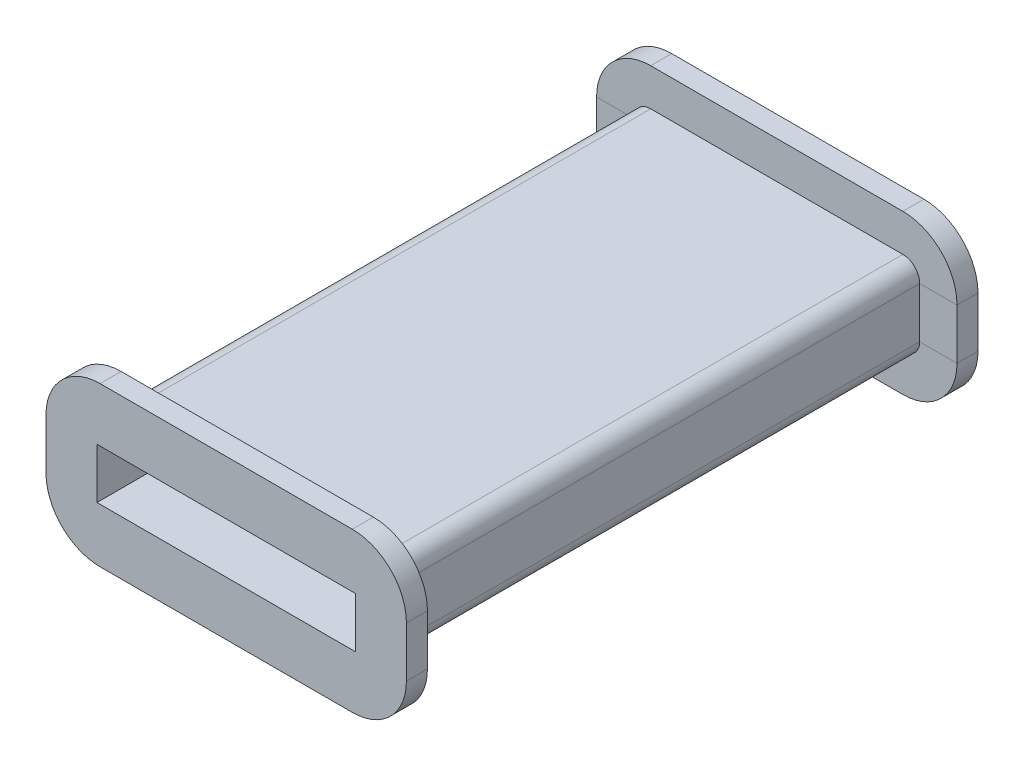
ISO-10303-21;
HEADER;
FILE_DESCRIPTION(('STEP AP214'),'2;1');
FILE_NAME('part.step','',(''),(''),'','','');
FILE_SCHEMA(('AUTOMOTIVE_DESIGN { 1 0 10303 214 1 1 1 1 }'));
ENDSEC;
DATA;
#1=APPLICATION_CONTEXT('core data for automotive mechanical design processes');
#2=APPLICATION_PROTOCOL_DEFINITION('international standard','automotive_design',2000,#1);
#3=PRODUCT_CONTEXT('',#1,'mechanical');
#4=PRODUCT('Part','Part','',(#3));
#5=PRODUCT_RELATED_PRODUCT_CATEGORY('part','',(#4));
#6=PRODUCT_DEFINITION_FORMATION('','',#4);
#7=PRODUCT_DEFINITION_CONTEXT('part definition',#1,'design');
#8=PRODUCT_DEFINITION('design','',#6,#7);
#9=PRODUCT_DEFINITION_SHAPE('','',#8);
#10=(LENGTH_UNIT() NAMED_UNIT(*) SI_UNIT(.MILLI.,.METRE.));
#11=(NAMED_UNIT(*) PLANE_ANGLE_UNIT() SI_UNIT($,.RADIAN.));
#12=(NAMED_UNIT(*) SI_UNIT($,.STERADIAN.) SOLID_ANGLE_UNIT());
#13=UNCERTAINTY_MEASURE_WITH_UNIT(LENGTH_MEASURE(1.E-05),#10,'distance_accuracy_value','');
#14=(GEOMETRIC_REPRESENTATION_CONTEXT(3) GLOBAL_UNCERTAINTY_ASSIGNED_CONTEXT((#13)) GLOBAL_UNIT_ASSIGNED_CONTEXT((#10,
#11,#12)) REPRESENTATION_CONTEXT('',''));
#15=CARTESIAN_POINT('',(0.,0.,0.));
#16=DIRECTION('',(0.,0.,1.));
#17=DIRECTION('',(1.,0.,0.));
#18=AXIS2_PLACEMENT_3D('',#15,#16,#17);
#19=CARTESIAN_POINT('',(-13.6,-2.4,27.2));
#20=DIRECTION('',(1.,0.,0.));
#21=DIRECTION('',(0.,0.,-1.));
#22=AXIS2_PLACEMENT_3D('',#19,#20,#21);
#23=PLANE('',#22);
#24=DIRECTION('',(0.,1.,0.));
#25=VECTOR('',#24,1.);
#26=CARTESIAN_POINT('',(-13.6,-2.4,-25.2));
#27=LINE('',#26,#25);
#28=CARTESIAN_POINT('',(-13.6,-2.4,-25.2));
#29=VERTEX_POINT('',#28);
#30=CARTESIAN_POINT('',(-13.6,2.4,-25.2));
#31=VERTEX_POINT('',#30);
#32=EDGE_CURVE('E55',#29,#31,#27,.T.);
#33=ORIENTED_EDGE('',*,*,#32,.F.);
#34=DIRECTION('',(0.,0.,-1.));
#35=VECTOR('',#34,1.);
#36=CARTESIAN_POINT('',(-13.6,-2.4,27.2));
#37=LINE('',#36,#35);
#38=CARTESIAN_POINT('',(-13.6,-2.4,25.2));
#39=VERTEX_POINT('',#38);
#40=EDGE_CURVE('E517',#39,#29,#37,.T.);
#41=ORIENTED_EDGE('',*,*,#40,.F.);
#42=DIRECTION('',(0.,-1.,0.));
#43=VECTOR('',#42,1.);
#44=CARTESIAN_POINT('',(-13.6,2.4,25.2));
#45=LINE('',#44,#43);
#46=CARTESIAN_POINT('',(-13.6,2.4,25.2));
#47=VERTEX_POINT('',#46);
#48=EDGE_CURVE('E319',#47,#39,#45,.T.);
#49=ORIENTED_EDGE('',*,*,#48,.F.);
#50=DIRECTION('',(0.,0.,-1.));
#51=VECTOR('',#50,1.);
#52=CARTESIAN_POINT('',(-13.6,2.4,27.2));
#53=LINE('',#52,#51);
#54=EDGE_CURVE('E519',#47,#31,#53,.T.);
#55=ORIENTED_EDGE('',*,*,#54,.T.);
#56=EDGE_LOOP('',(#33,#41,#49,#55));
#57=FACE_BOUND('',#56,.T.);
#58=ADVANCED_FACE('F40',(#57),#23,.F.);
#59=CARTESIAN_POINT('',(-12.,-2.4,27.2));
#60=DIRECTION('',(0.,0.,-1.));
#61=DIRECTION('',(-1.,0.,0.));
#62=AXIS2_PLACEMENT_3D('',#59,#60,#61);
#63=CYLINDRICAL_SURFACE('',#62,1.6);
#64=CARTESIAN_POINT('',(-12.,-2.4,-25.2));
#65=DIRECTION('',(0.,0.,-1.));
#66=DIRECTION('',(0.,-1.,0.));
#67=AXIS2_PLACEMENT_3D('',#64,#65,#66);
#68=CIRCLE('',#67,1.6);
#69=CARTESIAN_POINT('',(-12.,-4.,-25.2));
#70=VERTEX_POINT('',#69);
#71=EDGE_CURVE('E271',#70,#29,#68,.T.);
#72=ORIENTED_EDGE('',*,*,#71,.F.);
#73=DIRECTION('',(0.,0.,-1.));
#74=VECTOR('',#73,1.);
#75=CARTESIAN_POINT('',(-12.,-4.,27.2));
#76=LINE('',#75,#74);
#77=CARTESIAN_POINT('',(-12.,-4.,25.2));
#78=VERTEX_POINT('',#77);
#79=EDGE_CURVE('E11',#78,#70,#76,.T.);
#80=ORIENTED_EDGE('',*,*,#79,.F.);
#81=CARTESIAN_POINT('',(-12.,-2.4,25.2));
#82=DIRECTION('',(0.,0.,1.));
#83=DIRECTION('',(-1.,0.,0.));
#84=AXIS2_PLACEMENT_3D('',#81,#82,#83);
#85=CIRCLE('',#84,1.6);
#86=EDGE_CURVE('E327',#39,#78,#85,.T.);
#87=ORIENTED_EDGE('',*,*,#86,.F.);
#88=ORIENTED_EDGE('',*,*,#40,.T.);
#89=EDGE_LOOP('',(#72,#80,#87,#88));
#90=FACE_BOUND('',#89,.T.);
#91=ADVANCED_FACE('F42',(#90),#63,.T.);
#92=CARTESIAN_POINT('',(-12.,2.4,27.2));
#93=DIRECTION('',(0.,0.,-1.));
#94=DIRECTION('',(-1.,0.,0.));
#95=AXIS2_PLACEMENT_3D('',#92,#93,#94);
#96=CYLINDRICAL_SURFACE('',#95,1.6);
#97=CARTESIAN_POINT('',(-12.,2.4,-25.2));
#98=DIRECTION('',(0.,0.,-1.));
#99=DIRECTION('',(-1.,0.,0.));
#100=AXIS2_PLACEMENT_3D('',#97,#98,#99);
#101=CIRCLE('',#100,1.6);
#102=CARTESIAN_POINT('',(-12.,4.,-25.2));
#103=VERTEX_POINT('',#102);
#104=EDGE_CURVE('E63',#31,#103,#101,.T.);
#105=ORIENTED_EDGE('',*,*,#104,.F.);
#106=ORIENTED_EDGE('',*,*,#54,.F.);
#107=CARTESIAN_POINT('',(-12.,2.4,25.2));
#108=DIRECTION('',(0.,0.,1.));
#109=DIRECTION('',(0.,1.,0.));
#110=AXIS2_PLACEMENT_3D('',#107,#108,#109);
#111=CIRCLE('',#110,1.6);
#112=CARTESIAN_POINT('',(-12.,4.,25.2));
#113=VERTEX_POINT('',#112);
#114=EDGE_CURVE('E310',#113,#47,#111,.T.);
#115=ORIENTED_EDGE('',*,*,#114,.F.);
#116=DIRECTION('',(0.,0.,-1.));
#117=VECTOR('',#116,1.);
#118=CARTESIAN_POINT('',(-12.,4.,27.2));
#119=LINE('',#118,#117);
#120=EDGE_CURVE('E521',#113,#103,#119,.T.);
#121=ORIENTED_EDGE('',*,*,#120,.T.);
#122=EDGE_LOOP('',(#105,#106,#115,#121));
#123=FACE_BOUND('',#122,.T.);
#124=ADVANCED_FACE('F559',(#123),#96,.T.);
#125=CARTESIAN_POINT('',(13.6,2.4,27.2));
#126=DIRECTION('',(-1.,0.,0.));
#127=DIRECTION('',(0.,0.,1.));
#128=AXIS2_PLACEMENT_3D('',#125,#126,#127);
#129=PLANE('',#128);
#130=DIRECTION('',(0.,1.,0.));
#131=VECTOR('',#130,1.);
#132=CARTESIAN_POINT('',(13.6,-2.4,25.2));
#133=LINE('',#132,#131);
#134=CARTESIAN_POINT('',(13.6,-2.4,25.2));
#135=VERTEX_POINT('',#134);
#136=CARTESIAN_POINT('',(13.6,2.4,25.2));
#137=VERTEX_POINT('',#136);
#138=EDGE_CURVE('E359',#135,#137,#133,.T.);
#139=ORIENTED_EDGE('',*,*,#138,.F.);
#140=DIRECTION('',(0.,0.,-1.));
#141=VECTOR('',#140,1.);
#142=CARTESIAN_POINT('',(13.6,-2.4,27.2));
#143=LINE('',#142,#141);
#144=CARTESIAN_POINT('',(13.6,-2.4,-25.2));
#145=VERTEX_POINT('',#144);
#146=EDGE_CURVE('E528',#135,#145,#143,.T.);
#147=ORIENTED_EDGE('',*,*,#146,.T.);
#148=DIRECTION('',(0.,-1.,0.));
#149=VECTOR('',#148,1.);
#150=CARTESIAN_POINT('',(13.6,2.4,-25.2));
#151=LINE('',#150,#149);
#152=CARTESIAN_POINT('',(13.6,2.4,-25.2));
#153=VERTEX_POINT('',#152);
#154=EDGE_CURVE('E398',#153,#145,#151,.T.);
#155=ORIENTED_EDGE('',*,*,#154,.F.);
#156=DIRECTION('',(0.,0.,-1.));
#157=VECTOR('',#156,1.);
#158=CARTESIAN_POINT('',(13.6,2.4,27.2));
#159=LINE('',#158,#157);
#160=EDGE_CURVE('E526',#137,#153,#159,.T.);
#161=ORIENTED_EDGE('',*,*,#160,.F.);
#162=EDGE_LOOP('',(#139,#147,#155,#161));
#163=FACE_BOUND('',#162,.T.);
#164=ADVANCED_FACE('F546',(#163),#129,.F.);
#165=CARTESIAN_POINT('',(12.,-2.4,27.2));
#166=DIRECTION('',(0.,0.,-1.));
#167=DIRECTION('',(-1.,0.,0.));
#168=AXIS2_PLACEMENT_3D('',#165,#166,#167);
#169=CYLINDRICAL_SURFACE('',#168,1.6);
#170=CARTESIAN_POINT('',(12.,-2.4,25.2));
#171=DIRECTION('',(0.,0.,1.));
#172=DIRECTION('',(0.,-1.,0.));
#173=AXIS2_PLACEMENT_3D('',#170,#171,#172);
#174=CIRCLE('',#173,1.6);
#175=CARTESIAN_POINT('',(12.,-4.,25.2));
#176=VERTEX_POINT('',#175);
#177=EDGE_CURVE('E354',#176,#135,#174,.T.);
#178=ORIENTED_EDGE('',*,*,#177,.F.);
#179=DIRECTION('',(0.,0.,-1.));
#180=VECTOR('',#179,1.);
#181=CARTESIAN_POINT('',(12.,-4.,27.2));
#182=LINE('',#181,#180);
#183=CARTESIAN_POINT('',(12.,-4.,-25.2));
#184=VERTEX_POINT('',#183);
#185=EDGE_CURVE('E48',#176,#184,#182,.T.);
#186=ORIENTED_EDGE('',*,*,#185,.T.);
#187=CARTESIAN_POINT('',(12.,-2.4,-25.2));
#188=DIRECTION('',(0.,0.,-1.));
#189=DIRECTION('',(1.,0.,0.));
#190=AXIS2_PLACEMENT_3D('',#187,#188,#189);
#191=CIRCLE('',#190,1.6);
#192=EDGE_CURVE('E403',#145,#184,#191,.T.);
#193=ORIENTED_EDGE('',*,*,#192,.F.);
#194=ORIENTED_EDGE('',*,*,#146,.F.);
#195=EDGE_LOOP('',(#178,#186,#193,#194));
#196=FACE_BOUND('',#195,.T.);
#197=ADVANCED_FACE('F533',(#196),#169,.T.);
#198=CARTESIAN_POINT('',(12.,2.4,27.2));
#199=DIRECTION('',(0.,0.,-1.));
#200=DIRECTION('',(-1.,0.,0.));
#201=AXIS2_PLACEMENT_3D('',#198,#199,#200);
#202=CYLINDRICAL_SURFACE('',#201,1.6);
#203=CARTESIAN_POINT('',(12.,2.4,25.2));
#204=DIRECTION('',(0.,0.,1.));
#205=DIRECTION('',(1.,0.,0.));
#206=AXIS2_PLACEMENT_3D('',#203,#204,#205);
#207=CIRCLE('',#206,1.6);
#208=CARTESIAN_POINT('',(12.,4.,25.2));
#209=VERTEX_POINT('',#208);
#210=EDGE_CURVE('E367',#137,#209,#207,.T.);
#211=ORIENTED_EDGE('',*,*,#210,.F.);
#212=ORIENTED_EDGE('',*,*,#160,.T.);
#213=CARTESIAN_POINT('',(12.,2.4,-25.2));
#214=DIRECTION('',(0.,0.,-1.));
#215=DIRECTION('',(0.,1.,0.));
#216=AXIS2_PLACEMENT_3D('',#213,#214,#215);
#217=CIRCLE('',#216,1.6);
#218=CARTESIAN_POINT('',(12.,4.,-25.2));
#219=VERTEX_POINT('',#218);
#220=EDGE_CURVE('E390',#219,#153,#217,.T.);
#221=ORIENTED_EDGE('',*,*,#220,.F.);
#222=DIRECTION('',(0.,0.,-1.));
#223=VECTOR('',#222,1.);
#224=CARTESIAN_POINT('',(12.,4.,27.2));
#225=LINE('',#224,#223);
#226=EDGE_CURVE('E523',#209,#219,#225,.T.);
#227=ORIENTED_EDGE('',*,*,#226,.F.);
#228=EDGE_LOOP('',(#211,#212,#221,#227));
#229=FACE_BOUND('',#228,.T.);
#230=ADVANCED_FACE('F598',(#229),#202,.T.);
#231=CARTESIAN_POINT('',(-12.,4.,27.2));
#232=DIRECTION('',(0.,-1.,0.));
#233=DIRECTION('',(0.,0.,-1.));
#234=AXIS2_PLACEMENT_3D('',#231,#232,#233);
#235=PLANE('',#234);
#236=DIRECTION('',(-1.,0.,0.));
#237=VECTOR('',#236,1.);
#238=CARTESIAN_POINT('',(12.,4.,25.2));
#239=LINE('',#238,#237);
#240=EDGE_CURVE('E461',#209,#113,#239,.T.);
#241=ORIENTED_EDGE('',*,*,#240,.F.);
#242=ORIENTED_EDGE('',*,*,#226,.T.);
#243=DIRECTION('',(-1.,0.,0.));
#244=VECTOR('',#243,1.);
#245=CARTESIAN_POINT('',(12.,4.,-25.2));
#246=LINE('',#245,#244);
#247=EDGE_CURVE('E478',#219,#103,#246,.T.);
#248=ORIENTED_EDGE('',*,*,#247,.T.);
#249=ORIENTED_EDGE('',*,*,#120,.F.);
#250=EDGE_LOOP('',(#241,#242,#248,#249));
#251=FACE_BOUND('',#250,.T.);
#252=ADVANCED_FACE('F601',(#251),#235,.F.);
#253=CARTESIAN_POINT('',(-12.,-2.4,27.2));
#254=DIRECTION('',(0.,0.,1.));
#255=DIRECTION('',(1.,0.,0.));
#256=AXIS2_PLACEMENT_3D('',#253,#254,#255);
#257=PLANE('',#256);
#258=CARTESIAN_POINT('',(-12.,-2.4,27.2));
#259=DIRECTION('',(0.,0.,1.));
#260=DIRECTION('',(-1.,0.,0.));
#261=AXIS2_PLACEMENT_3D('',#258,#259,#260);
#262=CIRCLE('',#261,5.14999999999999);
#263=CARTESIAN_POINT('',(-17.15,-2.4,27.2));
#264=VERTEX_POINT('',#263);
#265=CARTESIAN_POINT('',(-12.,-7.54999999999999,27.2));
#266=VERTEX_POINT('',#265);
#267=EDGE_CURVE('E330',#264,#266,#262,.T.);
#268=ORIENTED_EDGE('',*,*,#267,.T.);
#269=DIRECTION('',(-1.,0.,0.));
#270=VECTOR('',#269,1.);
#271=CARTESIAN_POINT('',(12.,-7.54999999999999,27.2));
#272=LINE('',#271,#270);
#273=CARTESIAN_POINT('',(12.,-7.54999999999999,27.2));
#274=VERTEX_POINT('',#273);
#275=EDGE_CURVE('E449',#274,#266,#272,.T.);
#276=ORIENTED_EDGE('',*,*,#275,.F.);
#277=CARTESIAN_POINT('',(12.,-2.4,27.2));
#278=DIRECTION('',(0.,0.,1.));
#279=DIRECTION('',(0.,-1.,0.));
#280=AXIS2_PLACEMENT_3D('',#277,#278,#279);
#281=CIRCLE('',#280,5.14999999999999);
#282=CARTESIAN_POINT('',(17.15,-2.4,27.2));
#283=VERTEX_POINT('',#282);
#284=EDGE_CURVE('E347',#274,#283,#281,.T.);
#285=ORIENTED_EDGE('',*,*,#284,.T.);
#286=DIRECTION('',(0.,1.,0.));
#287=VECTOR('',#286,1.);
#288=CARTESIAN_POINT('',(17.15,-2.4,27.2));
#289=LINE('',#288,#287);
#290=CARTESIAN_POINT('',(17.15,2.40000000000001,27.2));
#291=VERTEX_POINT('',#290);
#292=EDGE_CURVE('E360',#283,#291,#289,.T.);
#293=ORIENTED_EDGE('',*,*,#292,.T.);
#294=CARTESIAN_POINT('',(12.,2.4,27.2));
#295=DIRECTION('',(0.,0.,1.));
#296=DIRECTION('',(1.,0.,0.));
#297=AXIS2_PLACEMENT_3D('',#294,#295,#296);
#298=CIRCLE('',#297,5.14999999999999);
#299=CARTESIAN_POINT('',(12.,7.54999999999999,27.2));
#300=VERTEX_POINT('',#299);
#301=EDGE_CURVE('E364',#291,#300,#298,.T.);
#302=ORIENTED_EDGE('',*,*,#301,.T.);
#303=DIRECTION('',(-1.,0.,0.));
#304=VECTOR('',#303,1.);
#305=CARTESIAN_POINT('',(12.,7.54999999999999,27.2));
#306=LINE('',#305,#304);
#307=CARTESIAN_POINT('',(-12.,7.54999999999999,27.2));
#308=VERTEX_POINT('',#307);
#309=EDGE_CURVE('E466',#300,#308,#306,.T.);
#310=ORIENTED_EDGE('',*,*,#309,.T.);
#311=CARTESIAN_POINT('',(-12.,2.4,27.2));
#312=DIRECTION('',(0.,0.,1.));
#313=DIRECTION('',(0.,1.,0.));
#314=AXIS2_PLACEMENT_3D('',#311,#312,#313);
#315=CIRCLE('',#314,5.14999999999999);
#316=CARTESIAN_POINT('',(-17.15,2.40000000000001,27.2));
#317=VERTEX_POINT('',#316);
#318=EDGE_CURVE('E337',#308,#317,#315,.T.);
#319=ORIENTED_EDGE('',*,*,#318,.T.);
#320=DIRECTION('',(0.,-1.,0.));
#321=VECTOR('',#320,1.);
#322=CARTESIAN_POINT('',(-17.15,2.4,27.2));
#323=LINE('',#322,#321);
#324=EDGE_CURVE('E342',#317,#264,#323,.T.);
#325=ORIENTED_EDGE('',*,*,#324,.T.);
#326=EDGE_LOOP('',(#268,#276,#285,#293,#302,#310,#319,#325));
#327=FACE_BOUND('',#326,.T.);
#328=DIRECTION('',(0.,1.,0.));
#329=VECTOR('',#328,1.);
#330=CARTESIAN_POINT('',(12.3,2.4,27.2));
#331=LINE('',#330,#329);
#332=CARTESIAN_POINT('',(12.3,-2.4,27.2));
#333=VERTEX_POINT('',#332);
#334=CARTESIAN_POINT('',(12.3,2.4,27.2));
#335=VERTEX_POINT('',#334);
#336=EDGE_CURVE('E489',#333,#335,#331,.T.);
#337=ORIENTED_EDGE('',*,*,#336,.F.);
#338=DIRECTION('',(1.,0.,0.));
#339=VECTOR('',#338,1.);
#340=CARTESIAN_POINT('',(12.3,-2.4,27.2));
#341=LINE('',#340,#339);
#342=CARTESIAN_POINT('',(-12.3,-2.4,27.2));
#343=VERTEX_POINT('',#342);
#344=EDGE_CURVE('E487',#343,#333,#341,.T.);
#345=ORIENTED_EDGE('',*,*,#344,.F.);
#346=DIRECTION('',(0.,-1.,0.));
#347=VECTOR('',#346,1.);
#348=CARTESIAN_POINT('',(-12.3,-2.4,27.2));
#349=LINE('',#348,#347);
#350=CARTESIAN_POINT('',(-12.3,2.4,27.2));
#351=VERTEX_POINT('',#350);
#352=EDGE_CURVE('E495',#351,#343,#349,.T.);
#353=ORIENTED_EDGE('',*,*,#352,.F.);
#354=DIRECTION('',(-1.,0.,0.));
#355=VECTOR('',#354,1.);
#356=CARTESIAN_POINT('',(-12.3,2.4,27.2));
#357=LINE('',#356,#355);
#358=EDGE_CURVE('E492',#335,#351,#357,.T.);
#359=ORIENTED_EDGE('',*,*,#358,.F.);
#360=EDGE_LOOP('',(#337,#345,#353,#359));
#361=FACE_BOUND('',#360,.T.);
#362=ADVANCED_FACE('F576',(#327,#361),#257,.T.);
#363=CARTESIAN_POINT('',(-12.,-2.4,-27.2));
#364=DIRECTION('',(0.,0.,1.));
#365=DIRECTION('',(1.,0.,0.));
#366=AXIS2_PLACEMENT_3D('',#363,#364,#365);
#367=PLANE('',#366);
#368=CARTESIAN_POINT('',(12.,-2.4,-27.2));
#369=DIRECTION('',(0.,0.,-1.));
#370=DIRECTION('',(1.,0.,0.));
#371=AXIS2_PLACEMENT_3D('',#368,#369,#370);
#372=CIRCLE('',#371,5.15);
#373=CARTESIAN_POINT('',(17.15,-2.4,-27.2));
#374=VERTEX_POINT('',#373);
#375=CARTESIAN_POINT('',(12.,-7.55,-27.2));
#376=VERTEX_POINT('',#375);
#377=EDGE_CURVE('E406',#374,#376,#372,.T.);
#378=ORIENTED_EDGE('',*,*,#377,.T.);
#379=DIRECTION('',(-1.,0.,0.));
#380=VECTOR('',#379,1.);
#381=CARTESIAN_POINT('',(12.,-7.55,-27.2));
#382=LINE('',#381,#380);
#383=CARTESIAN_POINT('',(-12.,-7.55,-27.2));
#384=VERTEX_POINT('',#383);
#385=EDGE_CURVE('E454',#376,#384,#382,.T.);
#386=ORIENTED_EDGE('',*,*,#385,.T.);
#387=CARTESIAN_POINT('',(-12.,-2.4,-27.2));
#388=DIRECTION('',(0.,0.,-1.));
#389=DIRECTION('',(0.,-1.,0.));
#390=AXIS2_PLACEMENT_3D('',#387,#388,#389);
#391=CIRCLE('',#390,5.15);
#392=CARTESIAN_POINT('',(-17.15,-2.4,-27.2));
#393=VERTEX_POINT('',#392);
#394=EDGE_CURVE('E281',#384,#393,#391,.T.);
#395=ORIENTED_EDGE('',*,*,#394,.T.);
#396=DIRECTION('',(0.,1.,0.));
#397=VECTOR('',#396,1.);
#398=CARTESIAN_POINT('',(-17.15,-2.4,-27.2));
#399=LINE('',#398,#397);
#400=CARTESIAN_POINT('',(-17.15,2.4,-27.2));
#401=VERTEX_POINT('',#400);
#402=EDGE_CURVE('E277',#393,#401,#399,.T.);
#403=ORIENTED_EDGE('',*,*,#402,.T.);
#404=CARTESIAN_POINT('',(-12.,2.4,-27.2));
#405=DIRECTION('',(0.,0.,-1.));
#406=DIRECTION('',(-1.,0.,0.));
#407=AXIS2_PLACEMENT_3D('',#404,#405,#406);
#408=CIRCLE('',#407,5.15);
#409=CARTESIAN_POINT('',(-12.,7.55,-27.2));
#410=VERTEX_POINT('',#409);
#411=EDGE_CURVE('E293',#401,#410,#408,.T.);
#412=ORIENTED_EDGE('',*,*,#411,.T.);
#413=DIRECTION('',(-1.,0.,0.));
#414=VECTOR('',#413,1.);
#415=CARTESIAN_POINT('',(12.,7.55,-27.2));
#416=LINE('',#415,#414);
#417=CARTESIAN_POINT('',(12.,7.55,-27.2));
#418=VERTEX_POINT('',#417);
#419=EDGE_CURVE('E484',#418,#410,#416,.T.);
#420=ORIENTED_EDGE('',*,*,#419,.F.);
#421=CARTESIAN_POINT('',(12.,2.4,-27.2));
#422=DIRECTION('',(0.,0.,-1.));
#423=DIRECTION('',(0.,1.,0.));
#424=AXIS2_PLACEMENT_3D('',#421,#422,#423);
#425=CIRCLE('',#424,5.15);
#426=CARTESIAN_POINT('',(17.15,2.40000000000001,-27.2));
#427=VERTEX_POINT('',#426);
#428=EDGE_CURVE('E410',#418,#427,#425,.T.);
#429=ORIENTED_EDGE('',*,*,#428,.T.);
#430=DIRECTION('',(0.,-1.,0.));
#431=VECTOR('',#430,1.);
#432=CARTESIAN_POINT('',(17.15,2.4,-27.2));
#433=LINE('',#432,#431);
#434=EDGE_CURVE('E416',#427,#374,#433,.T.);
#435=ORIENTED_EDGE('',*,*,#434,.T.);
#436=EDGE_LOOP('',(#378,#386,#395,#403,#412,#420,#429,#435));
#437=FACE_BOUND('',#436,.T.);
#438=DIRECTION('',(1.,0.,0.));
#439=VECTOR('',#438,1.);
#440=CARTESIAN_POINT('',(12.3,-2.4,-27.2));
#441=LINE('',#440,#439);
#442=CARTESIAN_POINT('',(-12.3,-2.4,-27.2));
#443=VERTEX_POINT('',#442);
#444=CARTESIAN_POINT('',(12.3,-2.4,-27.2));
#445=VERTEX_POINT('',#444);
#446=EDGE_CURVE('E486',#443,#445,#441,.T.);
#447=ORIENTED_EDGE('',*,*,#446,.T.);
#448=DIRECTION('',(0.,1.,0.));
#449=VECTOR('',#448,1.);
#450=CARTESIAN_POINT('',(12.3,2.4,-27.2));
#451=LINE('',#450,#449);
#452=CARTESIAN_POINT('',(12.3,2.4,-27.2));
#453=VERTEX_POINT('',#452);
#454=EDGE_CURVE('E500',#445,#453,#451,.T.);
#455=ORIENTED_EDGE('',*,*,#454,.T.);
#456=DIRECTION('',(-1.,0.,0.));
#457=VECTOR('',#456,1.);
#458=CARTESIAN_POINT('',(-12.3,2.4,-27.2));
#459=LINE('',#458,#457);
#460=CARTESIAN_POINT('',(-12.3,2.4,-27.2));
#461=VERTEX_POINT('',#460);
#462=EDGE_CURVE('E503',#453,#461,#459,.T.);
#463=ORIENTED_EDGE('',*,*,#462,.T.);
#464=DIRECTION('',(0.,-1.,0.));
#465=VECTOR('',#464,1.);
#466=CARTESIAN_POINT('',(-12.3,-2.4,-27.2));
#467=LINE('',#466,#465);
#468=EDGE_CURVE('E490',#461,#443,#467,.T.);
#469=ORIENTED_EDGE('',*,*,#468,.T.);
#470=EDGE_LOOP('',(#447,#455,#463,#469));
#471=FACE_BOUND('',#470,.T.);
#472=ADVANCED_FACE('F611',(#437,#471),#367,.F.);
#473=CARTESIAN_POINT('',(-12.,-4.,27.2));
#474=DIRECTION('',(0.,1.,0.));
#475=DIRECTION('',(0.,0.,1.));
#476=AXIS2_PLACEMENT_3D('',#473,#474,#475);
#477=PLANE('',#476);
#478=ORIENTED_EDGE('',*,*,#185,.F.);
#479=DIRECTION('',(-1.,0.,0.));
#480=VECTOR('',#479,1.);
#481=CARTESIAN_POINT('',(12.,-4.,25.2));
#482=LINE('',#481,#480);
#483=EDGE_CURVE('E443',#176,#78,#482,.T.);
#484=ORIENTED_EDGE('',*,*,#483,.T.);
#485=ORIENTED_EDGE('',*,*,#79,.T.);
#486=DIRECTION('',(-1.,0.,0.));
#487=VECTOR('',#486,1.);
#488=CARTESIAN_POINT('',(12.,-4.,-25.2));
#489=LINE('',#488,#487);
#490=EDGE_CURVE('E459',#184,#70,#489,.T.);
#491=ORIENTED_EDGE('',*,*,#490,.F.);
#492=EDGE_LOOP('',(#478,#484,#485,#491));
#493=FACE_BOUND('',#492,.T.);
#494=ADVANCED_FACE('F537',(#493),#477,.F.);
#495=CARTESIAN_POINT('',(12.3,-2.4,27.2));
#496=DIRECTION('',(0.,1.,0.));
#497=DIRECTION('',(0.,0.,1.));
#498=AXIS2_PLACEMENT_3D('',#495,#496,#497);
#499=PLANE('',#498);
#500=ORIENTED_EDGE('',*,*,#446,.F.);
#501=DIRECTION('',(0.,0.,-1.));
#502=VECTOR('',#501,1.);
#503=CARTESIAN_POINT('',(-12.3,-2.4,27.2));
#504=LINE('',#503,#502);
#505=EDGE_CURVE('E497',#343,#443,#504,.T.);
#506=ORIENTED_EDGE('',*,*,#505,.F.);
#507=ORIENTED_EDGE('',*,*,#344,.T.);
#508=DIRECTION('',(0.,0.,-1.));
#509=VECTOR('',#508,1.);
#510=CARTESIAN_POINT('',(12.3,-2.4,27.2));
#511=LINE('',#510,#509);
#512=EDGE_CURVE('E514',#333,#445,#511,.T.);
#513=ORIENTED_EDGE('',*,*,#512,.T.);
#514=EDGE_LOOP('',(#500,#506,#507,#513));
#515=FACE_BOUND('',#514,.T.);
#516=ADVANCED_FACE('F657',(#515),#499,.T.);
#517=CARTESIAN_POINT('',(12.3,2.4,27.2));
#518=DIRECTION('',(-1.,0.,0.));
#519=DIRECTION('',(0.,0.,1.));
#520=AXIS2_PLACEMENT_3D('',#517,#518,#519);
#521=PLANE('',#520);
#522=ORIENTED_EDGE('',*,*,#454,.F.);
#523=ORIENTED_EDGE('',*,*,#512,.F.);
#524=ORIENTED_EDGE('',*,*,#336,.T.);
#525=DIRECTION('',(0.,0.,-1.));
#526=VECTOR('',#525,1.);
#527=CARTESIAN_POINT('',(12.3,2.4,27.2));
#528=LINE('',#527,#526);
#529=EDGE_CURVE('E512',#335,#453,#528,.T.);
#530=ORIENTED_EDGE('',*,*,#529,.T.);
#531=EDGE_LOOP('',(#522,#523,#524,#530));
#532=FACE_BOUND('',#531,.T.);
#533=ADVANCED_FACE('F662',(#532),#521,.T.);
#534=CARTESIAN_POINT('',(-12.3,2.4,27.2));
#535=DIRECTION('',(0.,-1.,0.));
#536=DIRECTION('',(0.,0.,-1.));
#537=AXIS2_PLACEMENT_3D('',#534,#535,#536);
#538=PLANE('',#537);
#539=ORIENTED_EDGE('',*,*,#462,.F.);
#540=ORIENTED_EDGE('',*,*,#529,.F.);
#541=ORIENTED_EDGE('',*,*,#358,.T.);
#542=DIRECTION('',(0.,0.,-1.));
#543=VECTOR('',#542,1.);
#544=CARTESIAN_POINT('',(-12.3,2.4,27.2));
#545=LINE('',#544,#543);
#546=EDGE_CURVE('E510',#351,#461,#545,.T.);
#547=ORIENTED_EDGE('',*,*,#546,.T.);
#548=EDGE_LOOP('',(#539,#540,#541,#547));
#549=FACE_BOUND('',#548,.T.);
#550=ADVANCED_FACE('F636',(#549),#538,.T.);
#551=CARTESIAN_POINT('',(-12.3,-2.4,27.2));
#552=DIRECTION('',(1.,0.,0.));
#553=DIRECTION('',(0.,0.,-1.));
#554=AXIS2_PLACEMENT_3D('',#551,#552,#553);
#555=PLANE('',#554);
#556=ORIENTED_EDGE('',*,*,#468,.F.);
#557=ORIENTED_EDGE('',*,*,#546,.F.);
#558=ORIENTED_EDGE('',*,*,#352,.T.);
#559=ORIENTED_EDGE('',*,*,#505,.T.);
#560=EDGE_LOOP('',(#556,#557,#558,#559));
#561=FACE_BOUND('',#560,.T.);
#562=ADVANCED_FACE('F629',(#561),#555,.T.);
#563=CARTESIAN_POINT('',(12.,7.55,-27.2));
#564=DIRECTION('',(0.,-1.,0.));
#565=DIRECTION('',(0.,0.,-1.));
#566=AXIS2_PLACEMENT_3D('',#563,#564,#565);
#567=PLANE('',#566);
#568=DIRECTION('',(0.,0.,1.));
#569=VECTOR('',#568,1.);
#570=CARTESIAN_POINT('',(-12.,7.55,-27.2));
#571=LINE('',#570,#569);
#572=CARTESIAN_POINT('',(-12.,7.55,-25.2));
#573=VERTEX_POINT('',#572);
#574=EDGE_CURVE('E472',#410,#573,#571,.T.);
#575=ORIENTED_EDGE('',*,*,#574,.T.);
#576=DIRECTION('',(-1.,0.,0.));
#577=VECTOR('',#576,1.);
#578=CARTESIAN_POINT('',(12.,7.55,-25.2));
#579=LINE('',#578,#577);
#580=CARTESIAN_POINT('',(12.,7.55,-25.2));
#581=VERTEX_POINT('',#580);
#582=EDGE_CURVE('E481',#581,#573,#579,.T.);
#583=ORIENTED_EDGE('',*,*,#582,.F.);
#584=DIRECTION('',(0.,0.,1.));
#585=VECTOR('',#584,1.);
#586=CARTESIAN_POINT('',(12.,7.55,-27.2));
#587=LINE('',#586,#585);
#588=EDGE_CURVE('E475',#418,#581,#587,.T.);
#589=ORIENTED_EDGE('',*,*,#588,.F.);
#590=ORIENTED_EDGE('',*,*,#419,.T.);
#591=EDGE_LOOP('',(#575,#583,#589,#590));
#592=FACE_BOUND('',#591,.T.);
#593=ADVANCED_FACE('F627',(#592),#567,.F.);
#594=CARTESIAN_POINT('',(12.,7.55,-25.2));
#595=DIRECTION('',(0.,0.,-1.));
#596=DIRECTION('',(-1.,0.,0.));
#597=AXIS2_PLACEMENT_3D('',#594,#595,#596);
#598=PLANE('',#597);
#599=ORIENTED_EDGE('',*,*,#582,.T.);
#600=CARTESIAN_POINT('',(-12.,2.4,-25.2));
#601=DIRECTION('',(0.,0.,-1.));
#602=DIRECTION('',(-1.,0.,0.));
#603=AXIS2_PLACEMENT_3D('',#600,#601,#602);
#604=CIRCLE('',#603,5.15);
#605=CARTESIAN_POINT('',(-17.15,2.4,-25.2));
#606=VERTEX_POINT('',#605);
#607=EDGE_CURVE('E296',#606,#573,#604,.T.);
#608=ORIENTED_EDGE('',*,*,#607,.F.);
#609=DIRECTION('',(-1.,0.,0.));
#610=VECTOR('',#609,1.);
#611=CARTESIAN_POINT('',(-13.6,2.4,-25.2));
#612=LINE('',#611,#610);
#613=EDGE_CURVE('E258',#31,#606,#612,.T.);
#614=ORIENTED_EDGE('',*,*,#613,.F.);
#615=ORIENTED_EDGE('',*,*,#104,.T.);
#616=ORIENTED_EDGE('',*,*,#247,.F.);
#617=ORIENTED_EDGE('',*,*,#220,.T.);
#618=DIRECTION('',(-1.,0.,0.));
#619=VECTOR('',#618,1.);
#620=CARTESIAN_POINT('',(17.15,2.40000000000001,-25.2));
#621=LINE('',#620,#619);
#622=CARTESIAN_POINT('',(17.15,2.40000000000001,-25.2));
#623=VERTEX_POINT('',#622);
#624=EDGE_CURVE('E402',#623,#153,#621,.T.);
#625=ORIENTED_EDGE('',*,*,#624,.F.);
#626=CARTESIAN_POINT('',(12.,2.4,-25.2));
#627=DIRECTION('',(0.,0.,-1.));
#628=DIRECTION('',(0.,1.,0.));
#629=AXIS2_PLACEMENT_3D('',#626,#627,#628);
#630=CIRCLE('',#629,5.15);
#631=EDGE_CURVE('E425',#581,#623,#630,.T.);
#632=ORIENTED_EDGE('',*,*,#631,.F.);
#633=EDGE_LOOP('',(#599,#608,#614,#615,#616,#617,#625,#632));
#634=FACE_BOUND('',#633,.T.);
#635=ADVANCED_FACE('F603',(#634),#598,.F.);
#636=CARTESIAN_POINT('',(12.,4.,25.2));
#637=DIRECTION('',(0.,0.,1.));
#638=DIRECTION('',(1.,0.,0.));
#639=AXIS2_PLACEMENT_3D('',#636,#637,#638);
#640=PLANE('',#639);
#641=ORIENTED_EDGE('',*,*,#240,.T.);
#642=ORIENTED_EDGE('',*,*,#114,.T.);
#643=DIRECTION('',(1.,0.,0.));
#644=VECTOR('',#643,1.);
#645=CARTESIAN_POINT('',(-17.15,2.40000000000001,25.2));
#646=LINE('',#645,#644);
#647=CARTESIAN_POINT('',(-17.15,2.40000000000001,25.2));
#648=VERTEX_POINT('',#647);
#649=EDGE_CURVE('E307',#648,#47,#646,.T.);
#650=ORIENTED_EDGE('',*,*,#649,.F.);
#651=CARTESIAN_POINT('',(-12.,2.4,25.2));
#652=DIRECTION('',(0.,0.,1.));
#653=DIRECTION('',(0.,1.,0.));
#654=AXIS2_PLACEMENT_3D('',#651,#652,#653);
#655=CIRCLE('',#654,5.14999999999999);
#656=CARTESIAN_POINT('',(-12.,7.54999999999999,25.2));
#657=VERTEX_POINT('',#656);
#658=EDGE_CURVE('E304',#657,#648,#655,.T.);
#659=ORIENTED_EDGE('',*,*,#658,.F.);
#660=DIRECTION('',(-1.,0.,0.));
#661=VECTOR('',#660,1.);
#662=CARTESIAN_POINT('',(12.,7.54999999999999,25.2));
#663=LINE('',#662,#661);
#664=CARTESIAN_POINT('',(12.,7.54999999999999,25.2));
#665=VERTEX_POINT('',#664);
#666=EDGE_CURVE('E464',#665,#657,#663,.T.);
#667=ORIENTED_EDGE('',*,*,#666,.F.);
#668=CARTESIAN_POINT('',(12.,2.4,25.2));
#669=DIRECTION('',(0.,0.,1.));
#670=DIRECTION('',(1.,0.,0.));
#671=AXIS2_PLACEMENT_3D('',#668,#669,#670);
#672=CIRCLE('',#671,5.14999999999999);
#673=CARTESIAN_POINT('',(17.15,2.40000000000001,25.2));
#674=VERTEX_POINT('',#673);
#675=EDGE_CURVE('E377',#674,#665,#672,.T.);
#676=ORIENTED_EDGE('',*,*,#675,.F.);
#677=DIRECTION('',(1.,0.,0.));
#678=VECTOR('',#677,1.);
#679=CARTESIAN_POINT('',(13.6,2.4,25.2));
#680=LINE('',#679,#678);
#681=EDGE_CURVE('E374',#137,#674,#680,.T.);
#682=ORIENTED_EDGE('',*,*,#681,.F.);
#683=ORIENTED_EDGE('',*,*,#210,.T.);
#684=EDGE_LOOP('',(#641,#642,#650,#659,#667,#676,#682,#683));
#685=FACE_BOUND('',#684,.T.);
#686=ADVANCED_FACE('F562',(#685),#640,.F.);
#687=CARTESIAN_POINT('',(12.,7.54999999999999,27.2));
#688=DIRECTION('',(0.,-1.,0.));
#689=DIRECTION('',(0.,0.,-1.));
#690=AXIS2_PLACEMENT_3D('',#687,#688,#689);
#691=PLANE('',#690);
#692=DIRECTION('',(0.,0.,1.));
#693=VECTOR('',#692,1.);
#694=CARTESIAN_POINT('',(-12.,7.54999999999999,27.2));
#695=LINE('',#694,#693);
#696=EDGE_CURVE('E470',#657,#308,#695,.T.);
#697=ORIENTED_EDGE('',*,*,#696,.T.);
#698=ORIENTED_EDGE('',*,*,#309,.F.);
#699=DIRECTION('',(0.,0.,1.));
#700=VECTOR('',#699,1.);
#701=CARTESIAN_POINT('',(12.,7.54999999999999,27.2));
#702=LINE('',#701,#700);
#703=EDGE_CURVE('E469',#665,#300,#702,.T.);
#704=ORIENTED_EDGE('',*,*,#703,.F.);
#705=ORIENTED_EDGE('',*,*,#666,.T.);
#706=EDGE_LOOP('',(#697,#698,#704,#705));
#707=FACE_BOUND('',#706,.T.);
#708=ADVANCED_FACE('F596',(#707),#691,.F.);
#709=CARTESIAN_POINT('',(12.,-7.55,-25.2));
#710=DIRECTION('',(0.,0.,1.));
#711=DIRECTION('',(1.,0.,0.));
#712=AXIS2_PLACEMENT_3D('',#709,#710,#711);
#713=PLANE('',#712);
#714=ORIENTED_EDGE('',*,*,#490,.T.);
#715=ORIENTED_EDGE('',*,*,#71,.T.);
#716=DIRECTION('',(-1.,0.,0.));
#717=VECTOR('',#716,1.);
#718=CARTESIAN_POINT('',(-13.6,-2.4,-25.2));
#719=LINE('',#718,#717);
#720=CARTESIAN_POINT('',(-17.15,-2.4,-25.2));
#721=VERTEX_POINT('',#720);
#722=EDGE_CURVE('E255',#29,#721,#719,.T.);
#723=ORIENTED_EDGE('',*,*,#722,.T.);
#724=CARTESIAN_POINT('',(-12.,-2.4,-25.2));
#725=DIRECTION('',(0.,0.,-1.));
#726=DIRECTION('',(0.,-1.,0.));
#727=AXIS2_PLACEMENT_3D('',#724,#725,#726);
#728=CIRCLE('',#727,5.15);
#729=CARTESIAN_POINT('',(-12.,-7.55,-25.2));
#730=VERTEX_POINT('',#729);
#731=EDGE_CURVE('E270',#730,#721,#728,.T.);
#732=ORIENTED_EDGE('',*,*,#731,.F.);
#733=DIRECTION('',(-1.,0.,0.));
#734=VECTOR('',#733,1.);
#735=CARTESIAN_POINT('',(12.,-7.55,-25.2));
#736=LINE('',#735,#734);
#737=CARTESIAN_POINT('',(12.,-7.55,-25.2));
#738=VERTEX_POINT('',#737);
#739=EDGE_CURVE('E457',#738,#730,#736,.T.);
#740=ORIENTED_EDGE('',*,*,#739,.F.);
#741=CARTESIAN_POINT('',(12.,-2.4,-25.2));
#742=DIRECTION('',(0.,0.,-1.));
#743=DIRECTION('',(1.,0.,0.));
#744=AXIS2_PLACEMENT_3D('',#741,#742,#743);
#745=CIRCLE('',#744,5.15);
#746=CARTESIAN_POINT('',(17.15,-2.4,-25.2));
#747=VERTEX_POINT('',#746);
#748=EDGE_CURVE('E422',#747,#738,#745,.T.);
#749=ORIENTED_EDGE('',*,*,#748,.F.);
#750=DIRECTION('',(-1.,0.,0.));
#751=VECTOR('',#750,1.);
#752=CARTESIAN_POINT('',(17.15,-2.4,-25.2));
#753=LINE('',#752,#751);
#754=EDGE_CURVE('E407',#747,#145,#753,.T.);
#755=ORIENTED_EDGE('',*,*,#754,.T.);
#756=ORIENTED_EDGE('',*,*,#192,.T.);
#757=EDGE_LOOP('',(#714,#715,#723,#732,#740,#749,#755,#756));
#758=FACE_BOUND('',#757,.T.);
#759=ADVANCED_FACE('F268',(#758),#713,.T.);
#760=CARTESIAN_POINT('',(12.,-7.55,-27.2));
#761=DIRECTION('',(0.,-1.,0.));
#762=DIRECTION('',(0.,0.,-1.));
#763=AXIS2_PLACEMENT_3D('',#760,#761,#762);
#764=PLANE('',#763);
#765=DIRECTION('',(0.,0.,1.));
#766=VECTOR('',#765,1.);
#767=CARTESIAN_POINT('',(-12.,-7.55,-27.2));
#768=LINE('',#767,#766);
#769=EDGE_CURVE('E286',#384,#730,#768,.T.);
#770=ORIENTED_EDGE('',*,*,#769,.F.);
#771=ORIENTED_EDGE('',*,*,#385,.F.);
#772=DIRECTION('',(0.,0.,1.));
#773=VECTOR('',#772,1.);
#774=CARTESIAN_POINT('',(12.,-7.55,-27.2));
#775=LINE('',#774,#773);
#776=EDGE_CURVE('E451',#376,#738,#775,.T.);
#777=ORIENTED_EDGE('',*,*,#776,.T.);
#778=ORIENTED_EDGE('',*,*,#739,.T.);
#779=EDGE_LOOP('',(#770,#771,#777,#778));
#780=FACE_BOUND('',#779,.T.);
#781=ADVANCED_FACE('F616',(#780),#764,.T.);
#782=CARTESIAN_POINT('',(12.,-7.54999999999999,27.2));
#783=DIRECTION('',(0.,-1.,0.));
#784=DIRECTION('',(0.,0.,-1.));
#785=AXIS2_PLACEMENT_3D('',#782,#783,#784);
#786=PLANE('',#785);
#787=DIRECTION('',(0.,0.,1.));
#788=VECTOR('',#787,1.);
#789=CARTESIAN_POINT('',(-12.,-7.54999999999999,27.2));
#790=LINE('',#789,#788);
#791=CARTESIAN_POINT('',(-12.,-7.54999999999999,25.2));
#792=VERTEX_POINT('',#791);
#793=EDGE_CURVE('E435',#792,#266,#790,.T.);
#794=ORIENTED_EDGE('',*,*,#793,.F.);
#795=DIRECTION('',(-1.,0.,0.));
#796=VECTOR('',#795,1.);
#797=CARTESIAN_POINT('',(12.,-7.54999999999999,25.2));
#798=LINE('',#797,#796);
#799=CARTESIAN_POINT('',(12.,-7.54999999999999,25.2));
#800=VERTEX_POINT('',#799);
#801=EDGE_CURVE('E447',#800,#792,#798,.T.);
#802=ORIENTED_EDGE('',*,*,#801,.F.);
#803=DIRECTION('',(0.,0.,1.));
#804=VECTOR('',#803,1.);
#805=CARTESIAN_POINT('',(12.,-7.54999999999999,27.2));
#806=LINE('',#805,#804);
#807=EDGE_CURVE('E440',#800,#274,#806,.T.);
#808=ORIENTED_EDGE('',*,*,#807,.T.);
#809=ORIENTED_EDGE('',*,*,#275,.T.);
#810=EDGE_LOOP('',(#794,#802,#808,#809));
#811=FACE_BOUND('',#810,.T.);
#812=ADVANCED_FACE('F582',(#811),#786,.T.);
#813=CARTESIAN_POINT('',(12.,-4.,25.2));
#814=DIRECTION('',(0.,0.,-1.));
#815=DIRECTION('',(-1.,0.,0.));
#816=AXIS2_PLACEMENT_3D('',#813,#814,#815);
#817=PLANE('',#816);
#818=ORIENTED_EDGE('',*,*,#801,.T.);
#819=CARTESIAN_POINT('',(-12.,-2.4,25.2));
#820=DIRECTION('',(0.,0.,1.));
#821=DIRECTION('',(-1.,0.,0.));
#822=AXIS2_PLACEMENT_3D('',#819,#820,#821);
#823=CIRCLE('',#822,5.14999999999999);
#824=CARTESIAN_POINT('',(-17.15,-2.4,25.2));
#825=VERTEX_POINT('',#824);
#826=EDGE_CURVE('E331',#825,#792,#823,.T.);
#827=ORIENTED_EDGE('',*,*,#826,.F.);
#828=DIRECTION('',(1.,0.,0.));
#829=VECTOR('',#828,1.);
#830=CARTESIAN_POINT('',(-17.15,-2.4,25.2));
#831=LINE('',#830,#829);
#832=EDGE_CURVE('E316',#825,#39,#831,.T.);
#833=ORIENTED_EDGE('',*,*,#832,.T.);
#834=ORIENTED_EDGE('',*,*,#86,.T.);
#835=ORIENTED_EDGE('',*,*,#483,.F.);
#836=ORIENTED_EDGE('',*,*,#177,.T.);
#837=DIRECTION('',(1.,0.,0.));
#838=VECTOR('',#837,1.);
#839=CARTESIAN_POINT('',(13.6,-2.4,25.2));
#840=LINE('',#839,#838);
#841=CARTESIAN_POINT('',(17.15,-2.4,25.2));
#842=VERTEX_POINT('',#841);
#843=EDGE_CURVE('E371',#135,#842,#840,.T.);
#844=ORIENTED_EDGE('',*,*,#843,.T.);
#845=CARTESIAN_POINT('',(12.,-2.4,25.2));
#846=DIRECTION('',(0.,0.,1.));
#847=DIRECTION('',(0.,-1.,0.));
#848=AXIS2_PLACEMENT_3D('',#845,#846,#847);
#849=CIRCLE('',#848,5.14999999999999);
#850=EDGE_CURVE('E380',#800,#842,#849,.T.);
#851=ORIENTED_EDGE('',*,*,#850,.F.);
#852=EDGE_LOOP('',(#818,#827,#833,#834,#835,#836,#844,#851));
#853=FACE_BOUND('',#852,.T.);
#854=ADVANCED_FACE('F554',(#853),#817,.T.);
#855=CARTESIAN_POINT('',(12.,2.4,-27.2));
#856=DIRECTION('',(0.,0.,-1.));
#857=DIRECTION('',(-1.,0.,0.));
#858=AXIS2_PLACEMENT_3D('',#855,#856,#857);
#859=CYLINDRICAL_SURFACE('',#858,5.15);
#860=ORIENTED_EDGE('',*,*,#631,.T.);
#861=DIRECTION('',(0.,0.,1.));
#862=VECTOR('',#861,1.);
#863=CARTESIAN_POINT('',(17.15,2.40000000000001,-27.2));
#864=LINE('',#863,#862);
#865=EDGE_CURVE('E413',#427,#623,#864,.T.);
#866=ORIENTED_EDGE('',*,*,#865,.F.);
#867=ORIENTED_EDGE('',*,*,#428,.F.);
#868=ORIENTED_EDGE('',*,*,#588,.T.);
#869=EDGE_LOOP('',(#860,#866,#867,#868));
#870=FACE_BOUND('',#869,.T.);
#871=ADVANCED_FACE('F625',(#870),#859,.T.);
#872=CARTESIAN_POINT('',(17.15,2.4,-27.2));
#873=DIRECTION('',(1.,0.,0.));
#874=DIRECTION('',(0.,0.,-1.));
#875=AXIS2_PLACEMENT_3D('',#872,#873,#874);
#876=PLANE('',#875);
#877=DIRECTION('',(0.,-1.,0.));
#878=VECTOR('',#877,1.);
#879=CARTESIAN_POINT('',(17.15,2.4,-25.2));
#880=LINE('',#879,#878);
#881=EDGE_CURVE('E430',#623,#747,#880,.T.);
#882=ORIENTED_EDGE('',*,*,#881,.T.);
#883=DIRECTION('',(0.,0.,1.));
#884=VECTOR('',#883,1.);
#885=CARTESIAN_POINT('',(17.15,-2.4,-27.2));
#886=LINE('',#885,#884);
#887=EDGE_CURVE('E419',#374,#747,#886,.T.);
#888=ORIENTED_EDGE('',*,*,#887,.F.);
#889=ORIENTED_EDGE('',*,*,#434,.F.);
#890=ORIENTED_EDGE('',*,*,#865,.T.);
#891=EDGE_LOOP('',(#882,#888,#889,#890));
#892=FACE_BOUND('',#891,.T.);
#893=ADVANCED_FACE('F621',(#892),#876,.T.);
#894=CARTESIAN_POINT('',(17.15,2.4,-25.2));
#895=DIRECTION('',(0.,0.,1.));
#896=DIRECTION('',(1.,0.,0.));
#897=AXIS2_PLACEMENT_3D('',#894,#895,#896);
#898=PLANE('',#897);
#899=ORIENTED_EDGE('',*,*,#754,.F.);
#900=ORIENTED_EDGE('',*,*,#881,.F.);
#901=ORIENTED_EDGE('',*,*,#624,.T.);
#902=ORIENTED_EDGE('',*,*,#154,.T.);
#903=EDGE_LOOP('',(#899,#900,#901,#902));
#904=FACE_BOUND('',#903,.T.);
#905=ADVANCED_FACE('F542',(#904),#898,.T.);
#906=CARTESIAN_POINT('',(12.,-2.4,-27.2));
#907=DIRECTION('',(0.,0.,-1.));
#908=DIRECTION('',(-1.,0.,0.));
#909=AXIS2_PLACEMENT_3D('',#906,#907,#908);
#910=CYLINDRICAL_SURFACE('',#909,5.15);
#911=ORIENTED_EDGE('',*,*,#748,.T.);
#912=ORIENTED_EDGE('',*,*,#776,.F.);
#913=ORIENTED_EDGE('',*,*,#377,.F.);
#914=ORIENTED_EDGE('',*,*,#887,.T.);
#915=EDGE_LOOP('',(#911,#912,#913,#914));
#916=FACE_BOUND('',#915,.T.);
#917=ADVANCED_FACE('F618',(#916),#910,.T.);
#918=CARTESIAN_POINT('',(12.,-2.4,27.2));
#919=DIRECTION('',(0.,0.,1.));
#920=DIRECTION('',(1.,0.,0.));
#921=AXIS2_PLACEMENT_3D('',#918,#919,#920);
#922=CYLINDRICAL_SURFACE('',#921,5.14999999999999);
#923=DIRECTION('',(0.,0.,1.));
#924=VECTOR('',#923,1.);
#925=CARTESIAN_POINT('',(17.15,-2.4,25.2));
#926=LINE('',#925,#924);
#927=EDGE_CURVE('E363',#842,#283,#926,.T.);
#928=ORIENTED_EDGE('',*,*,#927,.T.);
#929=ORIENTED_EDGE('',*,*,#284,.F.);
#930=ORIENTED_EDGE('',*,*,#807,.F.);
#931=ORIENTED_EDGE('',*,*,#850,.T.);
#932=EDGE_LOOP('',(#928,#929,#930,#931));
#933=FACE_BOUND('',#932,.T.);
#934=ADVANCED_FACE('F586',(#933),#922,.T.);
#935=CARTESIAN_POINT('',(13.6,-2.4,25.2));
#936=DIRECTION('',(0.,0.,1.));
#937=DIRECTION('',(1.,0.,0.));
#938=AXIS2_PLACEMENT_3D('',#935,#936,#937);
#939=PLANE('',#938);
#940=DIRECTION('',(0.,1.,0.));
#941=VECTOR('',#940,1.);
#942=CARTESIAN_POINT('',(17.15,-2.4,25.2));
#943=LINE('',#942,#941);
#944=EDGE_CURVE('E385',#842,#674,#943,.T.);
#945=ORIENTED_EDGE('',*,*,#944,.F.);
#946=ORIENTED_EDGE('',*,*,#843,.F.);
#947=ORIENTED_EDGE('',*,*,#138,.T.);
#948=ORIENTED_EDGE('',*,*,#681,.T.);
#949=EDGE_LOOP('',(#945,#946,#947,#948));
#950=FACE_BOUND('',#949,.T.);
#951=ADVANCED_FACE('F550',(#950),#939,.F.);
#952=CARTESIAN_POINT('',(17.15,-2.4,25.2));
#953=DIRECTION('',(-1.,0.,0.));
#954=DIRECTION('',(0.,0.,1.));
#955=AXIS2_PLACEMENT_3D('',#952,#953,#954);
#956=PLANE('',#955);
#957=DIRECTION('',(0.,0.,1.));
#958=VECTOR('',#957,1.);
#959=CARTESIAN_POINT('',(17.15,2.40000000000001,25.2));
#960=LINE('',#959,#958);
#961=EDGE_CURVE('E368',#674,#291,#960,.T.);
#962=ORIENTED_EDGE('',*,*,#961,.T.);
#963=ORIENTED_EDGE('',*,*,#292,.F.);
#964=ORIENTED_EDGE('',*,*,#927,.F.);
#965=ORIENTED_EDGE('',*,*,#944,.T.);
#966=EDGE_LOOP('',(#962,#963,#964,#965));
#967=FACE_BOUND('',#966,.T.);
#968=ADVANCED_FACE('F590',(#967),#956,.F.);
#969=CARTESIAN_POINT('',(12.,2.4,27.2));
#970=DIRECTION('',(0.,0.,1.));
#971=DIRECTION('',(1.,0.,0.));
#972=AXIS2_PLACEMENT_3D('',#969,#970,#971);
#973=CYLINDRICAL_SURFACE('',#972,5.14999999999999);
#974=ORIENTED_EDGE('',*,*,#703,.T.);
#975=ORIENTED_EDGE('',*,*,#301,.F.);
#976=ORIENTED_EDGE('',*,*,#961,.F.);
#977=ORIENTED_EDGE('',*,*,#675,.T.);
#978=EDGE_LOOP('',(#974,#975,#976,#977));
#979=FACE_BOUND('',#978,.T.);
#980=ADVANCED_FACE('F593',(#979),#973,.T.);
#981=CARTESIAN_POINT('',(-12.,2.4,27.2));
#982=DIRECTION('',(0.,0.,1.));
#983=DIRECTION('',(1.,0.,0.));
#984=AXIS2_PLACEMENT_3D('',#981,#982,#983);
#985=CYLINDRICAL_SURFACE('',#984,5.14999999999999);
#986=DIRECTION('',(0.,0.,-1.));
#987=VECTOR('',#986,1.);
#988=CARTESIAN_POINT('',(-17.15,2.40000000000001,27.2));
#989=LINE('',#988,#987);
#990=EDGE_CURVE('E326',#317,#648,#989,.T.);
#991=ORIENTED_EDGE('',*,*,#990,.F.);
#992=ORIENTED_EDGE('',*,*,#318,.F.);
#993=ORIENTED_EDGE('',*,*,#696,.F.);
#994=ORIENTED_EDGE('',*,*,#658,.T.);
#995=EDGE_LOOP('',(#991,#992,#993,#994));
#996=FACE_BOUND('',#995,.T.);
#997=ADVANCED_FACE('F573',(#996),#985,.T.);
#998=CARTESIAN_POINT('',(-17.15,2.4,25.2));
#999=DIRECTION('',(0.,0.,-1.));
#1000=DIRECTION('',(-1.,0.,0.));
#1001=AXIS2_PLACEMENT_3D('',#998,#999,#1000);
#1002=PLANE('',#1001);
#1003=ORIENTED_EDGE('',*,*,#48,.T.);
#1004=ORIENTED_EDGE('',*,*,#832,.F.);
#1005=DIRECTION('',(0.,-1.,0.));
#1006=VECTOR('',#1005,1.);
#1007=CARTESIAN_POINT('',(-17.15,2.4,25.2));
#1008=LINE('',#1007,#1006);
#1009=EDGE_CURVE('E320',#648,#825,#1008,.T.);
#1010=ORIENTED_EDGE('',*,*,#1009,.F.);
#1011=ORIENTED_EDGE('',*,*,#649,.T.);
#1012=EDGE_LOOP('',(#1003,#1004,#1010,#1011));
#1013=FACE_BOUND('',#1012,.T.);
#1014=ADVANCED_FACE('F566',(#1013),#1002,.T.);
#1015=CARTESIAN_POINT('',(-17.15,2.4,27.2));
#1016=DIRECTION('',(-1.,0.,0.));
#1017=DIRECTION('',(0.,0.,1.));
#1018=AXIS2_PLACEMENT_3D('',#1015,#1016,#1017);
#1019=PLANE('',#1018);
#1020=DIRECTION('',(0.,0.,-1.));
#1021=VECTOR('',#1020,1.);
#1022=CARTESIAN_POINT('',(-17.15,-2.4,27.2));
#1023=LINE('',#1022,#1021);
#1024=EDGE_CURVE('E334',#264,#825,#1023,.T.);
#1025=ORIENTED_EDGE('',*,*,#1024,.F.);
#1026=ORIENTED_EDGE('',*,*,#324,.F.);
#1027=ORIENTED_EDGE('',*,*,#990,.T.);
#1028=ORIENTED_EDGE('',*,*,#1009,.T.);
#1029=EDGE_LOOP('',(#1025,#1026,#1027,#1028));
#1030=FACE_BOUND('',#1029,.T.);
#1031=ADVANCED_FACE('F570',(#1030),#1019,.T.);
#1032=CARTESIAN_POINT('',(-12.,-2.4,27.2));
#1033=DIRECTION('',(0.,0.,1.));
#1034=DIRECTION('',(1.,0.,0.));
#1035=AXIS2_PLACEMENT_3D('',#1032,#1033,#1034);
#1036=CYLINDRICAL_SURFACE('',#1035,5.14999999999999);
#1037=ORIENTED_EDGE('',*,*,#793,.T.);
#1038=ORIENTED_EDGE('',*,*,#267,.F.);
#1039=ORIENTED_EDGE('',*,*,#1024,.T.);
#1040=ORIENTED_EDGE('',*,*,#826,.T.);
#1041=EDGE_LOOP('',(#1037,#1038,#1039,#1040));
#1042=FACE_BOUND('',#1041,.T.);
#1043=ADVANCED_FACE('F579',(#1042),#1036,.T.);
#1044=CARTESIAN_POINT('',(-12.,-2.4,-27.2));
#1045=DIRECTION('',(0.,0.,-1.));
#1046=DIRECTION('',(-1.,0.,0.));
#1047=AXIS2_PLACEMENT_3D('',#1044,#1045,#1046);
#1048=CYLINDRICAL_SURFACE('',#1047,5.15);
#1049=ORIENTED_EDGE('',*,*,#394,.F.);
#1050=ORIENTED_EDGE('',*,*,#769,.T.);
#1051=ORIENTED_EDGE('',*,*,#731,.T.);
#1052=DIRECTION('',(0.,0.,-1.));
#1053=VECTOR('',#1052,1.);
#1054=CARTESIAN_POINT('',(-17.15,-2.4,-25.2));
#1055=LINE('',#1054,#1053);
#1056=EDGE_CURVE('E274',#721,#393,#1055,.T.);
#1057=ORIENTED_EDGE('',*,*,#1056,.T.);
#1058=EDGE_LOOP('',(#1049,#1050,#1051,#1057));
#1059=FACE_BOUND('',#1058,.T.);
#1060=ADVANCED_FACE('F284',(#1059),#1048,.T.);
#1061=CARTESIAN_POINT('',(-17.15,-2.4,-25.2));
#1062=DIRECTION('',(1.,0.,0.));
#1063=DIRECTION('',(0.,1.,0.));
#1064=AXIS2_PLACEMENT_3D('',#1061,#1062,#1063);
#1065=PLANE('',#1064);
#1066=ORIENTED_EDGE('',*,*,#402,.F.);
#1067=ORIENTED_EDGE('',*,*,#1056,.F.);
#1068=DIRECTION('',(0.,1.,0.));
#1069=VECTOR('',#1068,1.);
#1070=CARTESIAN_POINT('',(-17.15,-2.4,-25.2));
#1071=LINE('',#1070,#1069);
#1072=EDGE_CURVE('E252',#721,#606,#1071,.T.);
#1073=ORIENTED_EDGE('',*,*,#1072,.T.);
#1074=DIRECTION('',(0.,0.,-1.));
#1075=VECTOR('',#1074,1.);
#1076=CARTESIAN_POINT('',(-17.15,2.4,-25.2));
#1077=LINE('',#1076,#1075);
#1078=EDGE_CURVE('E263',#606,#401,#1077,.T.);
#1079=ORIENTED_EDGE('',*,*,#1078,.T.);
#1080=EDGE_LOOP('',(#1066,#1067,#1073,#1079));
#1081=FACE_BOUND('',#1080,.T.);
#1082=ADVANCED_FACE('F275',(#1081),#1065,.F.);
#1083=CARTESIAN_POINT('',(-13.6,-2.4,-25.2));
#1084=DIRECTION('',(0.,0.,-1.));
#1085=DIRECTION('',(-1.,0.,0.));
#1086=AXIS2_PLACEMENT_3D('',#1083,#1084,#1085);
#1087=PLANE('',#1086);
#1088=ORIENTED_EDGE('',*,*,#613,.T.);
#1089=ORIENTED_EDGE('',*,*,#1072,.F.);
#1090=ORIENTED_EDGE('',*,*,#722,.F.);
#1091=ORIENTED_EDGE('',*,*,#32,.T.);
#1092=EDGE_LOOP('',(#1088,#1089,#1090,#1091));
#1093=FACE_BOUND('',#1092,.T.);
#1094=ADVANCED_FACE('F254',(#1093),#1087,.F.);
#1095=CARTESIAN_POINT('',(-12.,2.4,-27.2));
#1096=DIRECTION('',(0.,0.,-1.));
#1097=DIRECTION('',(-1.,0.,0.));
#1098=AXIS2_PLACEMENT_3D('',#1095,#1096,#1097);
#1099=CYLINDRICAL_SURFACE('',#1098,5.15);
#1100=ORIENTED_EDGE('',*,*,#411,.F.);
#1101=ORIENTED_EDGE('',*,*,#1078,.F.);
#1102=ORIENTED_EDGE('',*,*,#607,.T.);
#1103=ORIENTED_EDGE('',*,*,#574,.F.);
#1104=EDGE_LOOP('',(#1100,#1101,#1102,#1103));
#1105=FACE_BOUND('',#1104,.T.);
#1106=ADVANCED_FACE('F607',(#1105),#1099,.T.);
#1107=CLOSED_SHELL('',(#58,#91,#124,#164,#197,#230,#252,#362,#472,#494,#516,#533,#550,#562,#593,
#635,#686,#708,#759,#781,#812,#854,#871,#893,#905,#917,#934,#951,#968,#980,#997,#1014,#1031,
#1043,#1060,#1082,#1094,#1106));
#1108=MANIFOLD_SOLID_BREP('B2',#1107);
#1109=ADVANCED_BREP_SHAPE_REPRESENTATION('',(#18,#1108),#14);
#1110=SHAPE_DEFINITION_REPRESENTATION(#9,#1109);
ENDSEC;
END-ISO-10303-21;
